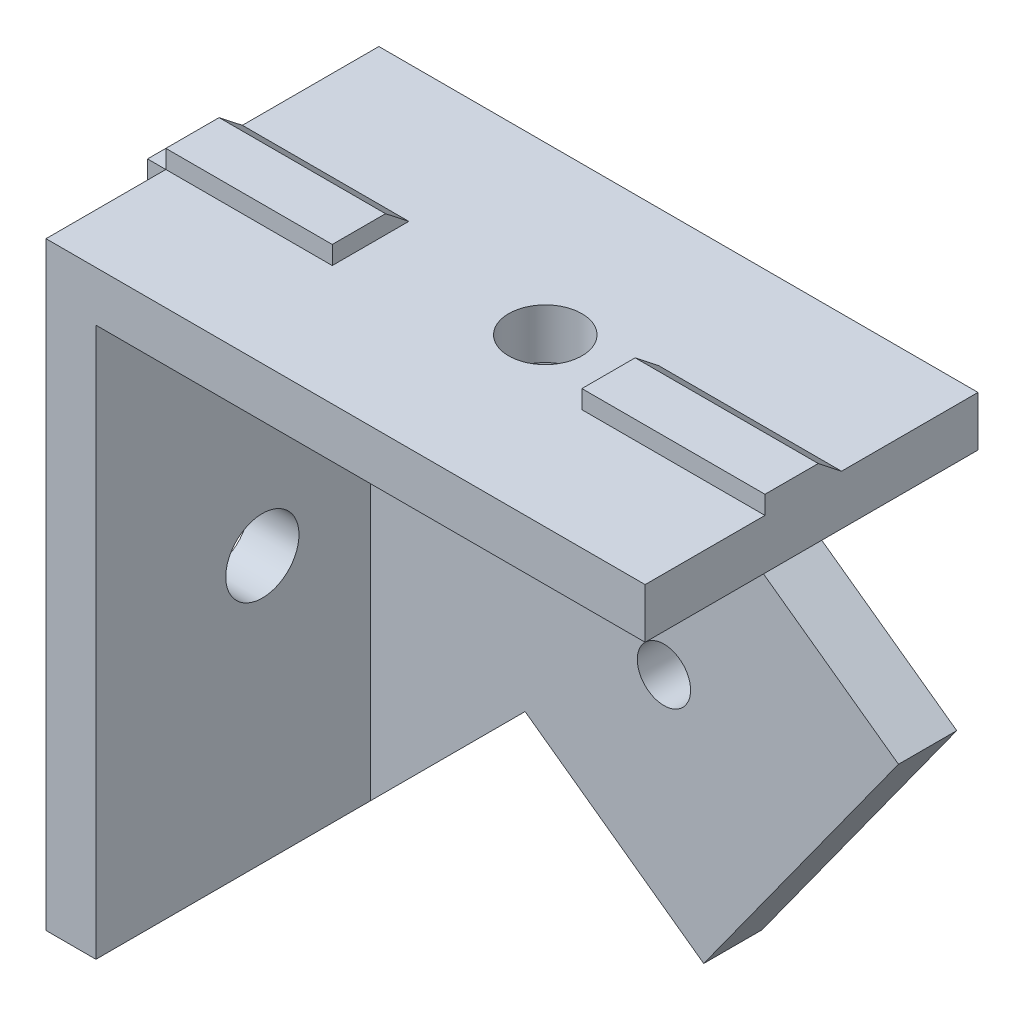
ISO-10303-21;
HEADER;
FILE_DESCRIPTION(('STEP AP214'),'2;1');
FILE_NAME('part.step','',(''),(''),'','','');
FILE_SCHEMA(('AUTOMOTIVE_DESIGN { 1 0 10303 214 1 1 1 1 }'));
ENDSEC;
DATA;
#1=APPLICATION_CONTEXT('core data for automotive mechanical design processes');
#2=APPLICATION_PROTOCOL_DEFINITION('international standard','automotive_design',2000,#1);
#3=PRODUCT_CONTEXT('',#1,'mechanical');
#4=PRODUCT('Part','Part','',(#3));
#5=PRODUCT_RELATED_PRODUCT_CATEGORY('part','',(#4));
#6=PRODUCT_DEFINITION_FORMATION('','',#4);
#7=PRODUCT_DEFINITION_CONTEXT('part definition',#1,'design');
#8=PRODUCT_DEFINITION('design','',#6,#7);
#9=PRODUCT_DEFINITION_SHAPE('','',#8);
#10=(LENGTH_UNIT() NAMED_UNIT(*) SI_UNIT(.MILLI.,.METRE.));
#11=(NAMED_UNIT(*) PLANE_ANGLE_UNIT() SI_UNIT($,.RADIAN.));
#12=(NAMED_UNIT(*) SI_UNIT($,.STERADIAN.) SOLID_ANGLE_UNIT());
#13=UNCERTAINTY_MEASURE_WITH_UNIT(LENGTH_MEASURE(1.E-05),#10,'distance_accuracy_value','');
#14=(GEOMETRIC_REPRESENTATION_CONTEXT(3) GLOBAL_UNCERTAINTY_ASSIGNED_CONTEXT((#13)) GLOBAL_UNIT_ASSIGNED_CONTEXT((#10,
#11,#12)) REPRESENTATION_CONTEXT('',''));
#15=CARTESIAN_POINT('',(0.,0.,0.));
#16=DIRECTION('',(0.,0.,1.));
#17=DIRECTION('',(1.,0.,0.));
#18=AXIS2_PLACEMENT_3D('',#15,#16,#17);
#19=CARTESIAN_POINT('',(36.,-3.,3.5));
#20=DIRECTION('',(-0.707106781186548,0.707106781186548,0.));
#21=DIRECTION('',(-0.707106781186548,-0.707106781186548,0.));
#22=AXIS2_PLACEMENT_3D('',#19,#20,#21);
#23=PLANE('',#22);
#24=DIRECTION('',(0.707106781186547,0.707106781186547,0.));
#25=VECTOR('',#24,1.);
#26=CARTESIAN_POINT('',(36.,-3.,3.5));
#27=LINE('',#26,#25);
#28=CARTESIAN_POINT('',(26.6123822519399,-12.3876177480601,3.5));
#29=VERTEX_POINT('',#28);
#30=CARTESIAN_POINT('',(36.,-3.,3.5));
#31=VERTEX_POINT('',#30);
#32=EDGE_CURVE('E51',#29,#31,#27,.T.);
#33=ORIENTED_EDGE('',*,*,#32,.F.);
#34=DIRECTION('',(0.,0.,1.));
#35=VECTOR('',#34,1.);
#36=CARTESIAN_POINT('',(26.6123822519399,-12.3876177480601,-31.4713419704018));
#37=LINE('',#36,#35);
#38=CARTESIAN_POINT('',(26.6123822519399,-12.3876177480601,0.));
#39=VERTEX_POINT('',#38);
#40=EDGE_CURVE('E220',#39,#29,#37,.T.);
#41=ORIENTED_EDGE('',*,*,#40,.F.);
#42=DIRECTION('',(0.707106781186547,0.707106781186547,0.));
#43=VECTOR('',#42,1.);
#44=CARTESIAN_POINT('',(36.,-3.,0.));
#45=LINE('',#44,#43);
#46=CARTESIAN_POINT('',(36.,-3.,0.));
#47=VERTEX_POINT('',#46);
#48=EDGE_CURVE('E218',#39,#47,#45,.T.);
#49=ORIENTED_EDGE('',*,*,#48,.T.);
#50=DIRECTION('',(0.,0.,-1.));
#51=VECTOR('',#50,1.);
#52=CARTESIAN_POINT('',(36.,-3.,3.5));
#53=LINE('',#52,#51);
#54=EDGE_CURVE('E379',#31,#47,#53,.T.);
#55=ORIENTED_EDGE('',*,*,#54,.F.);
#56=EDGE_LOOP('',(#33,#41,#49,#55));
#57=FACE_BOUND('',#56,.T.);
#58=ADVANCED_FACE('F35',(#57),#23,.F.);
#59=CARTESIAN_POINT('',(-1.1,4.72969343615419,9.6));
#60=DIRECTION('',(-0.786318338822423,0.,-0.617821551931904));
#61=DIRECTION('',(-0.617821551931904,0.,0.786318338822423));
#62=AXIS2_PLACEMENT_3D('',#59,#60,#61);
#63=PLANE('',#62);
#64=DIRECTION('',(-0.617821551931904,0.,0.786318338822423));
#65=VECTOR('',#64,1.);
#66=CARTESIAN_POINT('',(-1.1,-25.,9.6));
#67=LINE('',#66,#65);
#68=CARTESIAN_POINT('',(0.,-25.,8.19999999999999));
#69=VERTEX_POINT('',#68);
#70=CARTESIAN_POINT('',(-1.1,-25.,9.6));
#71=VERTEX_POINT('',#70);
#72=EDGE_CURVE('E262',#69,#71,#67,.T.);
#73=ORIENTED_EDGE('',*,*,#72,.F.);
#74=DIRECTION('',(0.,-1.,0.));
#75=VECTOR('',#74,1.);
#76=CARTESIAN_POINT('',(0.,4.72969343615419,8.2));
#77=LINE('',#76,#75);
#78=CARTESIAN_POINT('',(0.,-36.,8.2));
#79=VERTEX_POINT('',#78);
#80=EDGE_CURVE('E11',#69,#79,#77,.T.);
#81=ORIENTED_EDGE('',*,*,#80,.T.);
#82=DIRECTION('',(0.617821551931904,0.,-0.786318338822423));
#83=VECTOR('',#82,1.);
#84=CARTESIAN_POINT('',(-1.1,-36.,9.6));
#85=LINE('',#84,#83);
#86=CARTESIAN_POINT('',(-1.1,-36.,9.6));
#87=VERTEX_POINT('',#86);
#88=EDGE_CURVE('E264',#87,#79,#85,.T.);
#89=ORIENTED_EDGE('',*,*,#88,.F.);
#90=DIRECTION('',(0.,-1.,0.));
#91=VECTOR('',#90,1.);
#92=CARTESIAN_POINT('',(-1.1,4.72969343615419,9.6));
#93=LINE('',#92,#91);
#94=EDGE_CURVE('E277',#71,#87,#93,.T.);
#95=ORIENTED_EDGE('',*,*,#94,.F.);
#96=EDGE_LOOP('',(#73,#81,#89,#95));
#97=FACE_BOUND('',#96,.T.);
#98=ADVANCED_FACE('F481',(#97),#63,.T.);
#99=CARTESIAN_POINT('',(-1.1,4.72969343615419,12.8));
#100=DIRECTION('',(-1.,0.,0.));
#101=DIRECTION('',(0.,0.,1.));
#102=AXIS2_PLACEMENT_3D('',#99,#100,#101);
#103=PLANE('',#102);
#104=DIRECTION('',(0.,0.,1.));
#105=VECTOR('',#104,1.);
#106=CARTESIAN_POINT('',(-1.1,-25.,-2.50000000007189E-05));
#107=LINE('',#106,#105);
#108=CARTESIAN_POINT('',(-1.1,-25.,12.8));
#109=VERTEX_POINT('',#108);
#110=EDGE_CURVE('E255',#71,#109,#107,.T.);
#111=ORIENTED_EDGE('',*,*,#110,.F.);
#112=ORIENTED_EDGE('',*,*,#94,.T.);
#113=DIRECTION('',(0.,0.,-1.));
#114=VECTOR('',#113,1.);
#115=CARTESIAN_POINT('',(-1.1,-36.,12.8));
#116=LINE('',#115,#114);
#117=CARTESIAN_POINT('',(-1.1,-36.,12.8));
#118=VERTEX_POINT('',#117);
#119=EDGE_CURVE('E269',#118,#87,#116,.T.);
#120=ORIENTED_EDGE('',*,*,#119,.F.);
#121=DIRECTION('',(0.,-1.,0.));
#122=VECTOR('',#121,1.);
#123=CARTESIAN_POINT('',(-1.1,4.72969343615419,12.8));
#124=LINE('',#123,#122);
#125=EDGE_CURVE('E281',#109,#118,#124,.T.);
#126=ORIENTED_EDGE('',*,*,#125,.F.);
#127=EDGE_LOOP('',(#111,#112,#120,#126));
#128=FACE_BOUND('',#127,.T.);
#129=ADVANCED_FACE('F486',(#128),#103,.T.);
#130=CARTESIAN_POINT('',(0.,4.72969343615419,12.8));
#131=DIRECTION('',(0.,0.,1.));
#132=DIRECTION('',(1.,0.,0.));
#133=AXIS2_PLACEMENT_3D('',#130,#131,#132);
#134=PLANE('',#133);
#135=DIRECTION('',(1.,0.,0.));
#136=VECTOR('',#135,1.);
#137=CARTESIAN_POINT('',(0.,-25.,12.8));
#138=LINE('',#137,#136);
#139=CARTESIAN_POINT('',(0.,-25.,12.8));
#140=VERTEX_POINT('',#139);
#141=EDGE_CURVE('E248',#109,#140,#138,.T.);
#142=ORIENTED_EDGE('',*,*,#141,.F.);
#143=ORIENTED_EDGE('',*,*,#125,.T.);
#144=DIRECTION('',(-1.,0.,0.));
#145=VECTOR('',#144,1.);
#146=CARTESIAN_POINT('',(0.,-36.,12.8));
#147=LINE('',#146,#145);
#148=CARTESIAN_POINT('',(0.,-36.,12.8));
#149=VERTEX_POINT('',#148);
#150=EDGE_CURVE('E273',#149,#118,#147,.T.);
#151=ORIENTED_EDGE('',*,*,#150,.F.);
#152=DIRECTION('',(0.,-1.,0.));
#153=VECTOR('',#152,1.);
#154=CARTESIAN_POINT('',(0.,4.72969343615419,12.8));
#155=LINE('',#154,#153);
#156=EDGE_CURVE('E292',#140,#149,#155,.T.);
#157=ORIENTED_EDGE('',*,*,#156,.F.);
#158=EDGE_LOOP('',(#142,#143,#151,#157));
#159=FACE_BOUND('',#158,.T.);
#160=ADVANCED_FACE('F589',(#159),#134,.T.);
#161=CARTESIAN_POINT('',(0.,-36.,3.5));
#162=DIRECTION('',(1.,0.,0.));
#163=DIRECTION('',(0.,0.,-1.));
#164=AXIS2_PLACEMENT_3D('',#161,#162,#163);
#165=PLANE('',#164);
#166=DIRECTION('',(0.,0.,-1.));
#167=VECTOR('',#166,1.);
#168=CARTESIAN_POINT('',(0.,0.,8.2));
#169=LINE('',#168,#167);
#170=CARTESIAN_POINT('',(0.,0.,12.8));
#171=VERTEX_POINT('',#170);
#172=CARTESIAN_POINT('',(0.,0.,8.2));
#173=VERTEX_POINT('',#172);
#174=EDGE_CURVE('E313',#171,#173,#169,.T.);
#175=ORIENTED_EDGE('',*,*,#174,.F.);
#176=DIRECTION('',(0.,-1.,0.));
#177=VECTOR('',#176,1.);
#178=CARTESIAN_POINT('',(0.,0.,12.8));
#179=LINE('',#178,#177);
#180=CARTESIAN_POINT('',(0.,1.1,12.8));
#181=VERTEX_POINT('',#180);
#182=EDGE_CURVE('E337',#181,#171,#179,.T.);
#183=ORIENTED_EDGE('',*,*,#182,.F.);
#184=DIRECTION('',(0.,0.,1.));
#185=VECTOR('',#184,1.);
#186=CARTESIAN_POINT('',(0.,1.1,12.8));
#187=LINE('',#186,#185);
#188=CARTESIAN_POINT('',(0.,1.1,9.6));
#189=VERTEX_POINT('',#188);
#190=EDGE_CURVE('E334',#189,#181,#187,.T.);
#191=ORIENTED_EDGE('',*,*,#190,.F.);
#192=DIRECTION('',(0.,0.617821551931903,0.786318338822423));
#193=VECTOR('',#192,1.);
#194=CARTESIAN_POINT('',(0.,1.1,9.6));
#195=LINE('',#194,#193);
#196=EDGE_CURVE('E338',#173,#189,#195,.T.);
#197=ORIENTED_EDGE('',*,*,#196,.F.);
#198=EDGE_LOOP('',(#175,#183,#191,#197));
#199=FACE_BOUND('',#198,.T.);
#200=ADVANCED_FACE('F478',(#199),#165,.F.);
#201=CARTESIAN_POINT('',(0.,0.,12.8));
#202=DIRECTION('',(0.,0.,1.));
#203=DIRECTION('',(1.,0.,0.));
#204=AXIS2_PLACEMENT_3D('',#201,#202,#203);
#205=PLANE('',#204);
#206=DIRECTION('',(0.,1.,0.));
#207=VECTOR('',#206,1.);
#208=CARTESIAN_POINT('',(25.,1.1,12.8));
#209=LINE('',#208,#207);
#210=CARTESIAN_POINT('',(25.,0.,12.8));
#211=VERTEX_POINT('',#210);
#212=CARTESIAN_POINT('',(25.,1.1,12.8));
#213=VERTEX_POINT('',#212);
#214=EDGE_CURVE('E316',#211,#213,#209,.T.);
#215=ORIENTED_EDGE('',*,*,#214,.F.);
#216=DIRECTION('',(1.,0.,0.));
#217=VECTOR('',#216,1.);
#218=CARTESIAN_POINT('',(0.,0.,12.8));
#219=LINE('',#218,#217);
#220=CARTESIAN_POINT('',(36.,0.,12.8));
#221=VERTEX_POINT('',#220);
#222=EDGE_CURVE('E353',#211,#221,#219,.T.);
#223=ORIENTED_EDGE('',*,*,#222,.T.);
#224=DIRECTION('',(0.,-1.,0.));
#225=VECTOR('',#224,1.);
#226=CARTESIAN_POINT('',(36.,0.,12.8));
#227=LINE('',#226,#225);
#228=CARTESIAN_POINT('',(36.,1.1,12.8));
#229=VERTEX_POINT('',#228);
#230=EDGE_CURVE('E342',#229,#221,#227,.T.);
#231=ORIENTED_EDGE('',*,*,#230,.F.);
#232=DIRECTION('',(1.,0.,0.));
#233=VECTOR('',#232,1.);
#234=CARTESIAN_POINT('',(0.,1.1,12.8));
#235=LINE('',#234,#233);
#236=EDGE_CURVE('E872',#213,#229,#235,.T.);
#237=ORIENTED_EDGE('',*,*,#236,.F.);
#238=EDGE_LOOP('',(#215,#223,#231,#237));
#239=FACE_BOUND('',#238,.T.);
#240=ADVANCED_FACE('F596',(#239),#205,.T.);
#241=CARTESIAN_POINT('',(0.,1.1,12.8));
#242=DIRECTION('',(0.,1.,0.));
#243=DIRECTION('',(0.,0.,1.));
#244=AXIS2_PLACEMENT_3D('',#241,#242,#243);
#245=PLANE('',#244);
#246=DIRECTION('',(0.,0.,1.));
#247=VECTOR('',#246,1.);
#248=CARTESIAN_POINT('',(25.,1.1,-2.50000000007189E-05));
#249=LINE('',#248,#247);
#250=CARTESIAN_POINT('',(25.,1.1,9.6));
#251=VERTEX_POINT('',#250);
#252=EDGE_CURVE('E324',#251,#213,#249,.T.);
#253=ORIENTED_EDGE('',*,*,#252,.T.);
#254=ORIENTED_EDGE('',*,*,#236,.T.);
#255=DIRECTION('',(0.,0.,1.));
#256=VECTOR('',#255,1.);
#257=CARTESIAN_POINT('',(36.,1.1,12.8));
#258=LINE('',#257,#256);
#259=CARTESIAN_POINT('',(36.,1.1,9.6));
#260=VERTEX_POINT('',#259);
#261=EDGE_CURVE('E339',#260,#229,#258,.T.);
#262=ORIENTED_EDGE('',*,*,#261,.F.);
#263=DIRECTION('',(1.,0.,0.));
#264=VECTOR('',#263,1.);
#265=CARTESIAN_POINT('',(0.,1.1,9.6));
#266=LINE('',#265,#264);
#267=EDGE_CURVE('E399',#251,#260,#266,.T.);
#268=ORIENTED_EDGE('',*,*,#267,.F.);
#269=EDGE_LOOP('',(#253,#254,#262,#268));
#270=FACE_BOUND('',#269,.T.);
#271=ADVANCED_FACE('F735',(#270),#245,.T.);
#272=CARTESIAN_POINT('',(0.,1.1,9.6));
#273=DIRECTION('',(0.,0.786318338822423,-0.617821551931903));
#274=DIRECTION('',(0.,0.617821551931904,0.786318338822423));
#275=AXIS2_PLACEMENT_3D('',#272,#273,#274);
#276=PLANE('',#275);
#277=DIRECTION('',(0.,-0.617821551931904,-0.786318338822423));
#278=VECTOR('',#277,1.);
#279=CARTESIAN_POINT('',(25.,1.1,9.6));
#280=LINE('',#279,#278);
#281=CARTESIAN_POINT('',(25.,0.,8.2));
#282=VERTEX_POINT('',#281);
#283=EDGE_CURVE('E44',#251,#282,#280,.T.);
#284=ORIENTED_EDGE('',*,*,#283,.F.);
#285=ORIENTED_EDGE('',*,*,#267,.T.);
#286=DIRECTION('',(0.,0.617821551931903,0.786318338822423));
#287=VECTOR('',#286,1.);
#288=CARTESIAN_POINT('',(36.,1.1,9.6));
#289=LINE('',#288,#287);
#290=CARTESIAN_POINT('',(36.,0.,8.2));
#291=VERTEX_POINT('',#290);
#292=EDGE_CURVE('E327',#291,#260,#289,.T.);
#293=ORIENTED_EDGE('',*,*,#292,.F.);
#294=DIRECTION('',(1.,0.,0.));
#295=VECTOR('',#294,1.);
#296=CARTESIAN_POINT('',(0.,0.,8.2));
#297=LINE('',#296,#295);
#298=EDGE_CURVE('E378',#282,#291,#297,.T.);
#299=ORIENTED_EDGE('',*,*,#298,.F.);
#300=EDGE_LOOP('',(#284,#285,#293,#299));
#301=FACE_BOUND('',#300,.T.);
#302=ADVANCED_FACE('F425',(#301),#276,.T.);
#303=CARTESIAN_POINT('',(0.,0.,3.5));
#304=DIRECTION('',(0.,0.,-1.));
#305=DIRECTION('',(-1.,0.,0.));
#306=AXIS2_PLACEMENT_3D('',#303,#304,#305);
#307=PLANE('',#306);
#308=CARTESIAN_POINT('',(20.62970811701,-20.62970811701,3.5));
#309=DIRECTION('',(0.,0.,1.));
#310=DIRECTION('',(1.,0.,0.));
#311=AXIS2_PLACEMENT_3D('',#308,#309,#310);
#312=CIRCLE('',#311,1.6);
#313=CARTESIAN_POINT('',(22.22970811701,-20.62970811701,3.5));
#314=VERTEX_POINT('',#313);
#315=EDGE_CURVE('E457',#314,#314,#312,.T.);
#316=ORIENTED_EDGE('',*,*,#315,.F.);
#317=EDGE_LOOP('',(#316));
#318=FACE_BOUND('',#317,.T.);
#319=DIRECTION('',(1.,0.,0.));
#320=VECTOR('',#319,1.);
#321=CARTESIAN_POINT('',(36.,-3.,3.5));
#322=LINE('',#321,#320);
#323=CARTESIAN_POINT('',(3.,-3.,3.5));
#324=VERTEX_POINT('',#323);
#325=EDGE_CURVE('E563',#324,#31,#322,.T.);
#326=ORIENTED_EDGE('',*,*,#325,.F.);
#327=DIRECTION('',(0.,1.,0.));
#328=VECTOR('',#327,1.);
#329=CARTESIAN_POINT('',(3.,-3.,3.5));
#330=LINE('',#329,#328);
#331=CARTESIAN_POINT('',(3.,-36.,3.5));
#332=VERTEX_POINT('',#331);
#333=EDGE_CURVE('E556',#332,#324,#330,.T.);
#334=ORIENTED_EDGE('',*,*,#333,.F.);
#335=CARTESIAN_POINT('',(12.2863928787447,-26.7136071212553,3.5));
#336=VERTEX_POINT('',#335);
#337=EDGE_CURVE('E442',#332,#336,#27,.T.);
#338=ORIENTED_EDGE('',*,*,#337,.T.);
#339=DIRECTION('',(0.810953417130081,-0.585110720500867,0.));
#340=VECTOR('',#339,1.);
#341=CARTESIAN_POINT('',(23.0197020132234,-34.4577932956704,3.5));
#342=LINE('',#341,#340);
#343=CARTESIAN_POINT('',(23.0197020132234,-34.4577932956704,3.5));
#344=VERTEX_POINT('',#343);
#345=EDGE_CURVE('E239',#336,#344,#342,.T.);
#346=ORIENTED_EDGE('',*,*,#345,.T.);
#347=DIRECTION('',(0.585110720500867,0.810953417130081,0.));
#348=VECTOR('',#347,1.);
#349=CARTESIAN_POINT('',(34.7219164232408,-18.2387249530687,3.5));
#350=LINE('',#349,#348);
#351=CARTESIAN_POINT('',(34.7219164232408,-18.2387249530687,3.5));
#352=VERTEX_POINT('',#351);
#353=EDGE_CURVE('E235',#344,#352,#350,.T.);
#354=ORIENTED_EDGE('',*,*,#353,.T.);
#355=DIRECTION('',(-0.810953417130081,0.585110720500868,0.));
#356=VECTOR('',#355,1.);
#357=CARTESIAN_POINT('',(26.6123822519399,-12.3876177480601,3.5));
#358=LINE('',#357,#356);
#359=EDGE_CURVE('E226',#352,#29,#358,.T.);
#360=ORIENTED_EDGE('',*,*,#359,.T.);
#361=ORIENTED_EDGE('',*,*,#32,.T.);
#362=EDGE_LOOP('',(#326,#334,#338,#346,#354,#360,#361));
#363=FACE_BOUND('',#362,.T.);
#364=ADVANCED_FACE('F453',(#318,#363),#307,.F.);
#365=CARTESIAN_POINT('',(3.,-36.,3.5));
#366=DIRECTION('',(0.,1.,0.));
#367=DIRECTION('',(0.,0.,1.));
#368=AXIS2_PLACEMENT_3D('',#365,#366,#367);
#369=PLANE('',#368);
#370=DIRECTION('',(1.,0.,0.));
#371=VECTOR('',#370,1.);
#372=CARTESIAN_POINT('',(3.,-36.,0.));
#373=LINE('',#372,#371);
#374=CARTESIAN_POINT('',(0.,-36.,0.));
#375=VERTEX_POINT('',#374);
#376=CARTESIAN_POINT('',(3.,-36.,0.));
#377=VERTEX_POINT('',#376);
#378=EDGE_CURVE('E441',#375,#377,#373,.T.);
#379=ORIENTED_EDGE('',*,*,#378,.T.);
#380=DIRECTION('',(0.,0.,-1.));
#381=VECTOR('',#380,1.);
#382=CARTESIAN_POINT('',(3.,-36.,3.5));
#383=LINE('',#382,#381);
#384=EDGE_CURVE('E376',#332,#377,#383,.T.);
#385=ORIENTED_EDGE('',*,*,#384,.F.);
#386=DIRECTION('',(0.,0.,-1.));
#387=VECTOR('',#386,1.);
#388=CARTESIAN_POINT('',(3.,-36.,20.));
#389=LINE('',#388,#387);
#390=CARTESIAN_POINT('',(3.,-36.,20.));
#391=VERTEX_POINT('',#390);
#392=EDGE_CURVE('E447',#391,#332,#389,.T.);
#393=ORIENTED_EDGE('',*,*,#392,.F.);
#394=DIRECTION('',(1.,0.,0.));
#395=VECTOR('',#394,1.);
#396=CARTESIAN_POINT('',(3.,-36.,20.));
#397=LINE('',#396,#395);
#398=CARTESIAN_POINT('',(0.,-36.,20.));
#399=VERTEX_POINT('',#398);
#400=EDGE_CURVE('E559',#399,#391,#397,.T.);
#401=ORIENTED_EDGE('',*,*,#400,.F.);
#402=DIRECTION('',(0.,0.,-1.));
#403=VECTOR('',#402,1.);
#404=CARTESIAN_POINT('',(0.,-36.,3.5));
#405=LINE('',#404,#403);
#406=EDGE_CURVE('E356',#399,#149,#405,.T.);
#407=ORIENTED_EDGE('',*,*,#406,.T.);
#408=ORIENTED_EDGE('',*,*,#150,.T.);
#409=ORIENTED_EDGE('',*,*,#119,.T.);
#410=ORIENTED_EDGE('',*,*,#88,.T.);
#411=EDGE_CURVE('E306',#79,#375,#405,.T.);
#412=ORIENTED_EDGE('',*,*,#411,.T.);
#413=EDGE_LOOP('',(#379,#385,#393,#401,#407,#408,#409,#410,#412));
#414=FACE_BOUND('',#413,.T.);
#415=ADVANCED_FACE('F37',(#414),#369,.F.);
#416=CARTESIAN_POINT('',(12.2863928787447,-26.7136071212553,0.));
#417=VERTEX_POINT('',#416);
#418=EDGE_CURVE('E450',#377,#417,#45,.T.);
#419=ORIENTED_EDGE('',*,*,#418,.T.);
#420=DIRECTION('',(0.,0.,1.));
#421=VECTOR('',#420,1.);
#422=CARTESIAN_POINT('',(12.2863928787447,-26.7136071212553,-31.4713419704018));
#423=LINE('',#422,#421);
#424=EDGE_CURVE('E59',#417,#336,#423,.T.);
#425=ORIENTED_EDGE('',*,*,#424,.T.);
#426=ORIENTED_EDGE('',*,*,#337,.F.);
#427=ORIENTED_EDGE('',*,*,#384,.T.);
#428=EDGE_LOOP('',(#419,#425,#426,#427));
#429=FACE_BOUND('',#428,.T.);
#430=ADVANCED_FACE('F482',(#429),#23,.F.);
#431=CARTESIAN_POINT('',(36.,0.,3.5));
#432=DIRECTION('',(-1.,0.,0.));
#433=DIRECTION('',(0.,0.,1.));
#434=AXIS2_PLACEMENT_3D('',#431,#432,#433);
#435=PLANE('',#434);
#436=DIRECTION('',(0.,1.,0.));
#437=VECTOR('',#436,1.);
#438=CARTESIAN_POINT('',(36.,0.,0.));
#439=LINE('',#438,#437);
#440=CARTESIAN_POINT('',(36.,0.,0.));
#441=VERTEX_POINT('',#440);
#442=EDGE_CURVE('E429',#47,#441,#439,.T.);
#443=ORIENTED_EDGE('',*,*,#442,.T.);
#444=DIRECTION('',(0.,0.,-1.));
#445=VECTOR('',#444,1.);
#446=CARTESIAN_POINT('',(36.,0.,3.5));
#447=LINE('',#446,#445);
#448=EDGE_CURVE('E375',#291,#441,#447,.T.);
#449=ORIENTED_EDGE('',*,*,#448,.F.);
#450=ORIENTED_EDGE('',*,*,#292,.T.);
#451=ORIENTED_EDGE('',*,*,#261,.T.);
#452=ORIENTED_EDGE('',*,*,#230,.T.);
#453=CARTESIAN_POINT('',(36.,0.,20.));
#454=VERTEX_POINT('',#453);
#455=EDGE_CURVE('E381',#454,#221,#447,.T.);
#456=ORIENTED_EDGE('',*,*,#455,.F.);
#457=DIRECTION('',(0.,1.,0.));
#458=VECTOR('',#457,1.);
#459=CARTESIAN_POINT('',(36.,0.,20.));
#460=LINE('',#459,#458);
#461=CARTESIAN_POINT('',(36.,-3.,20.));
#462=VERTEX_POINT('',#461);
#463=EDGE_CURVE('E567',#462,#454,#460,.T.);
#464=ORIENTED_EDGE('',*,*,#463,.F.);
#465=DIRECTION('',(0.,0.,-1.));
#466=VECTOR('',#465,1.);
#467=CARTESIAN_POINT('',(36.,-3.,20.));
#468=LINE('',#467,#466);
#469=EDGE_CURVE('E575',#462,#31,#468,.T.);
#470=ORIENTED_EDGE('',*,*,#469,.T.);
#471=ORIENTED_EDGE('',*,*,#54,.T.);
#472=EDGE_LOOP('',(#443,#449,#450,#451,#452,#456,#464,#470,#471));
#473=FACE_BOUND('',#472,.T.);
#474=ADVANCED_FACE('F428',(#473),#435,.F.);
#475=CARTESIAN_POINT('',(0.,0.,3.5));
#476=DIRECTION('',(0.,-1.,0.));
#477=DIRECTION('',(0.,0.,-1.));
#478=AXIS2_PLACEMENT_3D('',#475,#476,#477);
#479=PLANE('',#478);
#480=CARTESIAN_POINT('',(10.,0.,8.2));
#481=VERTEX_POINT('',#480);
#482=EDGE_CURVE('E395',#173,#481,#297,.T.);
#483=ORIENTED_EDGE('',*,*,#482,.T.);
#484=DIRECTION('',(0.,0.,1.));
#485=VECTOR('',#484,1.);
#486=CARTESIAN_POINT('',(10.,0.,-2.50000000007189E-05));
#487=LINE('',#486,#485);
#488=CARTESIAN_POINT('',(10.,0.,12.8));
#489=VERTEX_POINT('',#488);
#490=EDGE_CURVE('E328',#481,#489,#487,.T.);
#491=ORIENTED_EDGE('',*,*,#490,.T.);
#492=EDGE_CURVE('E349',#171,#489,#219,.T.);
#493=ORIENTED_EDGE('',*,*,#492,.F.);
#494=DIRECTION('',(0.,0.,-1.));
#495=VECTOR('',#494,1.);
#496=CARTESIAN_POINT('',(0.,0.,3.5));
#497=LINE('',#496,#495);
#498=CARTESIAN_POINT('',(0.,0.,20.));
#499=VERTEX_POINT('',#498);
#500=EDGE_CURVE('E372',#499,#171,#497,.T.);
#501=ORIENTED_EDGE('',*,*,#500,.F.);
#502=DIRECTION('',(-1.,0.,0.));
#503=VECTOR('',#502,1.);
#504=CARTESIAN_POINT('',(0.,0.,20.));
#505=LINE('',#504,#503);
#506=EDGE_CURVE('E570',#454,#499,#505,.T.);
#507=ORIENTED_EDGE('',*,*,#506,.F.);
#508=ORIENTED_EDGE('',*,*,#455,.T.);
#509=ORIENTED_EDGE('',*,*,#222,.F.);
#510=DIRECTION('',(0.,0.,1.));
#511=VECTOR('',#510,1.);
#512=CARTESIAN_POINT('',(25.,0.,-2.50000000007189E-05));
#513=LINE('',#512,#511);
#514=EDGE_CURVE('E325',#282,#211,#513,.T.);
#515=ORIENTED_EDGE('',*,*,#514,.F.);
#516=ORIENTED_EDGE('',*,*,#298,.T.);
#517=ORIENTED_EDGE('',*,*,#448,.T.);
#518=DIRECTION('',(-1.,0.,0.));
#519=VECTOR('',#518,1.);
#520=CARTESIAN_POINT('',(0.,0.,0.));
#521=LINE('',#520,#519);
#522=CARTESIAN_POINT('',(0.,0.,0.));
#523=VERTEX_POINT('',#522);
#524=EDGE_CURVE('E432',#441,#523,#521,.T.);
#525=ORIENTED_EDGE('',*,*,#524,.T.);
#526=EDGE_CURVE('E357',#173,#523,#497,.T.);
#527=ORIENTED_EDGE('',*,*,#526,.F.);
#528=EDGE_LOOP('',(#483,#491,#493,#501,#507,#508,#509,#515,#516,#517,#525,#527));
#529=FACE_BOUND('',#528,.T.);
#530=CARTESIAN_POINT('',(20.,0.,10.));
#531=DIRECTION('',(0.,-1.,0.));
#532=DIRECTION('',(0.,0.,-1.));
#533=AXIS2_PLACEMENT_3D('',#530,#531,#532);
#534=CIRCLE('',#533,2.2);
#535=CARTESIAN_POINT('',(20.,0.,7.8));
#536=VERTEX_POINT('',#535);
#537=EDGE_CURVE('E553',#536,#536,#534,.T.);
#538=ORIENTED_EDGE('',*,*,#537,.T.);
#539=EDGE_LOOP('',(#538));
#540=FACE_BOUND('',#539,.T.);
#541=ADVANCED_FACE('F422',(#529,#540),#479,.F.);
#542=CARTESIAN_POINT('',(0.,-20.,10.));
#543=DIRECTION('',(1.,0.,0.));
#544=DIRECTION('',(0.,0.,-1.));
#545=AXIS2_PLACEMENT_3D('',#542,#543,#544);
#546=CIRCLE('',#545,2.2);
#547=CARTESIAN_POINT('',(0.,-20.,7.8));
#548=VERTEX_POINT('',#547);
#549=EDGE_CURVE('E403',#548,#548,#546,.T.);
#550=ORIENTED_EDGE('',*,*,#549,.T.);
#551=EDGE_LOOP('',(#550));
#552=FACE_BOUND('',#551,.T.);
#553=ORIENTED_EDGE('',*,*,#500,.T.);
#554=CARTESIAN_POINT('',(0.,-10.,12.8));
#555=VERTEX_POINT('',#554);
#556=EDGE_CURVE('E288',#171,#555,#155,.T.);
#557=ORIENTED_EDGE('',*,*,#556,.T.);
#558=DIRECTION('',(0.,0.,1.));
#559=VECTOR('',#558,1.);
#560=CARTESIAN_POINT('',(0.,-10.,-2.50000000007189E-05));
#561=LINE('',#560,#559);
#562=CARTESIAN_POINT('',(0.,-10.,8.2));
#563=VERTEX_POINT('',#562);
#564=EDGE_CURVE('E251',#563,#555,#561,.T.);
#565=ORIENTED_EDGE('',*,*,#564,.F.);
#566=EDGE_CURVE('E272',#173,#563,#77,.T.);
#567=ORIENTED_EDGE('',*,*,#566,.F.);
#568=ORIENTED_EDGE('',*,*,#526,.T.);
#569=DIRECTION('',(0.,-1.,0.));
#570=VECTOR('',#569,1.);
#571=CARTESIAN_POINT('',(0.,-36.,0.));
#572=LINE('',#571,#570);
#573=EDGE_CURVE('E361',#523,#375,#572,.T.);
#574=ORIENTED_EDGE('',*,*,#573,.T.);
#575=ORIENTED_EDGE('',*,*,#411,.F.);
#576=ORIENTED_EDGE('',*,*,#80,.F.);
#577=DIRECTION('',(0.,0.,1.));
#578=VECTOR('',#577,1.);
#579=CARTESIAN_POINT('',(0.,-25.,-2.50000000007189E-05));
#580=LINE('',#579,#578);
#581=EDGE_CURVE('E252',#69,#140,#580,.T.);
#582=ORIENTED_EDGE('',*,*,#581,.T.);
#583=ORIENTED_EDGE('',*,*,#156,.T.);
#584=ORIENTED_EDGE('',*,*,#406,.F.);
#585=DIRECTION('',(0.,-1.,0.));
#586=VECTOR('',#585,1.);
#587=CARTESIAN_POINT('',(0.,-36.,20.));
#588=LINE('',#587,#586);
#589=EDGE_CURVE('E572',#499,#399,#588,.T.);
#590=ORIENTED_EDGE('',*,*,#589,.F.);
#591=EDGE_LOOP('',(#553,#557,#565,#567,#568,#574,#575,#576,#582,#583,#584,#590));
#592=FACE_BOUND('',#591,.T.);
#593=ADVANCED_FACE('F436',(#552,#592),#165,.F.);
#594=CARTESIAN_POINT('',(0.,0.,0.));
#595=DIRECTION('',(0.,0.,-1.));
#596=DIRECTION('',(-1.,0.,0.));
#597=AXIS2_PLACEMENT_3D('',#594,#595,#596);
#598=PLANE('',#597);
#599=CARTESIAN_POINT('',(20.62970811701,-20.62970811701,0.));
#600=DIRECTION('',(0.,0.,-1.));
#601=DIRECTION('',(-1.,0.,0.));
#602=AXIS2_PLACEMENT_3D('',#599,#600,#601);
#603=CIRCLE('',#602,1.6);
#604=CARTESIAN_POINT('',(19.02970811701,-20.62970811701,0.));
#605=VERTEX_POINT('',#604);
#606=EDGE_CURVE('E39',#605,#605,#603,.T.);
#607=ORIENTED_EDGE('',*,*,#606,.F.);
#608=EDGE_LOOP('',(#607));
#609=FACE_BOUND('',#608,.T.);
#610=ORIENTED_EDGE('',*,*,#378,.F.);
#611=ORIENTED_EDGE('',*,*,#573,.F.);
#612=ORIENTED_EDGE('',*,*,#524,.F.);
#613=ORIENTED_EDGE('',*,*,#442,.F.);
#614=ORIENTED_EDGE('',*,*,#48,.F.);
#615=DIRECTION('',(-0.810953417130081,0.585110720500868,0.));
#616=VECTOR('',#615,1.);
#617=CARTESIAN_POINT('',(26.6123822519399,-12.3876177480601,0.));
#618=LINE('',#617,#616);
#619=CARTESIAN_POINT('',(34.7219164232408,-18.2387249530687,0.));
#620=VERTEX_POINT('',#619);
#621=EDGE_CURVE('E209',#620,#39,#618,.T.);
#622=ORIENTED_EDGE('',*,*,#621,.F.);
#623=DIRECTION('',(0.585110720500868,0.810953417130082,0.));
#624=VECTOR('',#623,1.);
#625=CARTESIAN_POINT('',(34.7219164232408,-18.2387249530687,0.));
#626=LINE('',#625,#624);
#627=CARTESIAN_POINT('',(23.0197020132234,-34.4577932956704,0.));
#628=VERTEX_POINT('',#627);
#629=EDGE_CURVE('E215',#628,#620,#626,.T.);
#630=ORIENTED_EDGE('',*,*,#629,.F.);
#631=DIRECTION('',(0.810953417130082,-0.585110720500868,0.));
#632=VECTOR('',#631,1.);
#633=CARTESIAN_POINT('',(23.0197020132234,-34.4577932956704,0.));
#634=LINE('',#633,#632);
#635=EDGE_CURVE('E241',#417,#628,#634,.T.);
#636=ORIENTED_EDGE('',*,*,#635,.F.);
#637=ORIENTED_EDGE('',*,*,#418,.F.);
#638=EDGE_LOOP('',(#610,#611,#612,#613,#614,#622,#630,#636,#637));
#639=FACE_BOUND('',#638,.T.);
#640=ADVANCED_FACE('F212',(#609,#639),#598,.T.);
#641=CARTESIAN_POINT('',(3.,-3.,20.));
#642=DIRECTION('',(-1.,0.,0.));
#643=DIRECTION('',(0.,0.,1.));
#644=AXIS2_PLACEMENT_3D('',#641,#642,#643);
#645=PLANE('',#644);
#646=CARTESIAN_POINT('',(3.,-20.,10.));
#647=DIRECTION('',(1.,0.,0.));
#648=DIRECTION('',(0.,0.,-1.));
#649=AXIS2_PLACEMENT_3D('',#646,#647,#648);
#650=CIRCLE('',#649,2.2);
#651=CARTESIAN_POINT('',(3.,-20.,7.8));
#652=VERTEX_POINT('',#651);
#653=EDGE_CURVE('E546',#652,#652,#650,.T.);
#654=ORIENTED_EDGE('',*,*,#653,.F.);
#655=EDGE_LOOP('',(#654));
#656=FACE_BOUND('',#655,.T.);
#657=ORIENTED_EDGE('',*,*,#333,.T.);
#658=DIRECTION('',(0.,0.,-1.));
#659=VECTOR('',#658,1.);
#660=CARTESIAN_POINT('',(3.,-3.,20.));
#661=LINE('',#660,#659);
#662=CARTESIAN_POINT('',(3.,-3.,20.));
#663=VERTEX_POINT('',#662);
#664=EDGE_CURVE('E579',#663,#324,#661,.T.);
#665=ORIENTED_EDGE('',*,*,#664,.F.);
#666=DIRECTION('',(0.,1.,0.));
#667=VECTOR('',#666,1.);
#668=CARTESIAN_POINT('',(3.,-3.,20.));
#669=LINE('',#668,#667);
#670=EDGE_CURVE('E562',#391,#663,#669,.T.);
#671=ORIENTED_EDGE('',*,*,#670,.F.);
#672=ORIENTED_EDGE('',*,*,#392,.T.);
#673=EDGE_LOOP('',(#657,#665,#671,#672));
#674=FACE_BOUND('',#673,.T.);
#675=ADVANCED_FACE('F467',(#656,#674),#645,.F.);
#676=CARTESIAN_POINT('',(36.,-3.,20.));
#677=DIRECTION('',(0.,1.,0.));
#678=DIRECTION('',(0.,0.,1.));
#679=AXIS2_PLACEMENT_3D('',#676,#677,#678);
#680=PLANE('',#679);
#681=CARTESIAN_POINT('',(20.,-3.,10.));
#682=DIRECTION('',(0.,-1.,0.));
#683=DIRECTION('',(0.,0.,-1.));
#684=AXIS2_PLACEMENT_3D('',#681,#682,#683);
#685=CIRCLE('',#684,2.2);
#686=CARTESIAN_POINT('',(20.,-3.,7.8));
#687=VERTEX_POINT('',#686);
#688=EDGE_CURVE('E551',#687,#687,#685,.T.);
#689=ORIENTED_EDGE('',*,*,#688,.F.);
#690=EDGE_LOOP('',(#689));
#691=FACE_BOUND('',#690,.T.);
#692=ORIENTED_EDGE('',*,*,#325,.T.);
#693=ORIENTED_EDGE('',*,*,#469,.F.);
#694=DIRECTION('',(1.,0.,0.));
#695=VECTOR('',#694,1.);
#696=CARTESIAN_POINT('',(36.,-3.,20.));
#697=LINE('',#696,#695);
#698=EDGE_CURVE('E565',#663,#462,#697,.T.);
#699=ORIENTED_EDGE('',*,*,#698,.F.);
#700=ORIENTED_EDGE('',*,*,#664,.T.);
#701=EDGE_LOOP('',(#692,#693,#699,#700));
#702=FACE_BOUND('',#701,.T.);
#703=ADVANCED_FACE('F473',(#691,#702),#680,.F.);
#704=CARTESIAN_POINT('',(0.,0.,20.));
#705=DIRECTION('',(0.,0.,-1.));
#706=DIRECTION('',(-1.,0.,0.));
#707=AXIS2_PLACEMENT_3D('',#704,#705,#706);
#708=PLANE('',#707);
#709=ORIENTED_EDGE('',*,*,#400,.T.);
#710=ORIENTED_EDGE('',*,*,#670,.T.);
#711=ORIENTED_EDGE('',*,*,#698,.T.);
#712=ORIENTED_EDGE('',*,*,#463,.T.);
#713=ORIENTED_EDGE('',*,*,#506,.T.);
#714=ORIENTED_EDGE('',*,*,#589,.T.);
#715=EDGE_LOOP('',(#709,#710,#711,#712,#713,#714));
#716=FACE_BOUND('',#715,.T.);
#717=ADVANCED_FACE('F587',(#716),#708,.F.);
#718=CARTESIAN_POINT('',(20.,0.,10.));
#719=DIRECTION('',(0.,-1.,0.));
#720=DIRECTION('',(0.,0.,-1.));
#721=AXIS2_PLACEMENT_3D('',#718,#719,#720);
#722=CYLINDRICAL_SURFACE('',#721,2.2);
#723=ORIENTED_EDGE('',*,*,#537,.F.);
#724=EDGE_LOOP('',(#723));
#725=FACE_BOUND('',#724,.T.);
#726=ORIENTED_EDGE('',*,*,#688,.T.);
#727=EDGE_LOOP('',(#726));
#728=FACE_BOUND('',#727,.T.);
#729=ADVANCED_FACE('F690',(#725,#728),#722,.F.);
#730=CARTESIAN_POINT('',(0.,-20.,10.));
#731=DIRECTION('',(1.,0.,0.));
#732=DIRECTION('',(0.,0.,-1.));
#733=AXIS2_PLACEMENT_3D('',#730,#731,#732);
#734=CYLINDRICAL_SURFACE('',#733,2.2);
#735=ORIENTED_EDGE('',*,*,#549,.F.);
#736=EDGE_LOOP('',(#735));
#737=FACE_BOUND('',#736,.T.);
#738=ORIENTED_EDGE('',*,*,#653,.T.);
#739=EDGE_LOOP('',(#738));
#740=FACE_BOUND('',#739,.T.);
#741=ADVANCED_FACE('F685',(#737,#740),#734,.F.);
#742=DIRECTION('',(0.,-1.,0.));
#743=VECTOR('',#742,1.);
#744=CARTESIAN_POINT('',(10.,1.1,12.8));
#745=LINE('',#744,#743);
#746=CARTESIAN_POINT('',(10.,1.1,12.8));
#747=VERTEX_POINT('',#746);
#748=EDGE_CURVE('E321',#747,#489,#745,.T.);
#749=ORIENTED_EDGE('',*,*,#748,.F.);
#750=EDGE_CURVE('E345',#181,#747,#235,.T.);
#751=ORIENTED_EDGE('',*,*,#750,.F.);
#752=ORIENTED_EDGE('',*,*,#182,.T.);
#753=ORIENTED_EDGE('',*,*,#492,.T.);
#754=EDGE_LOOP('',(#749,#751,#752,#753));
#755=FACE_BOUND('',#754,.T.);
#756=ADVANCED_FACE('F543',(#755),#205,.T.);
#757=DIRECTION('',(0.,0.,1.));
#758=VECTOR('',#757,1.);
#759=CARTESIAN_POINT('',(10.,1.1,-2.50000000007189E-05));
#760=LINE('',#759,#758);
#761=CARTESIAN_POINT('',(10.,1.1,9.6));
#762=VERTEX_POINT('',#761);
#763=EDGE_CURVE('E330',#762,#747,#760,.T.);
#764=ORIENTED_EDGE('',*,*,#763,.F.);
#765=EDGE_CURVE('E402',#189,#762,#266,.T.);
#766=ORIENTED_EDGE('',*,*,#765,.F.);
#767=ORIENTED_EDGE('',*,*,#190,.T.);
#768=ORIENTED_EDGE('',*,*,#750,.T.);
#769=EDGE_LOOP('',(#764,#766,#767,#768));
#770=FACE_BOUND('',#769,.T.);
#771=ADVANCED_FACE('F729',(#770),#245,.T.);
#772=DIRECTION('',(0.,0.617821551931904,0.786318338822423));
#773=VECTOR('',#772,1.);
#774=CARTESIAN_POINT('',(10.,1.1,9.6));
#775=LINE('',#774,#773);
#776=EDGE_CURVE('E408',#481,#762,#775,.T.);
#777=ORIENTED_EDGE('',*,*,#776,.F.);
#778=ORIENTED_EDGE('',*,*,#482,.F.);
#779=ORIENTED_EDGE('',*,*,#196,.T.);
#780=ORIENTED_EDGE('',*,*,#765,.T.);
#781=EDGE_LOOP('',(#777,#778,#779,#780));
#782=FACE_BOUND('',#781,.T.);
#783=ADVANCED_FACE('F657',(#782),#276,.T.);
#784=CARTESIAN_POINT('',(25.,1.1,-2.50000000007189E-05));
#785=DIRECTION('',(1.,0.,0.));
#786=DIRECTION('',(0.,0.,-1.));
#787=AXIS2_PLACEMENT_3D('',#784,#785,#786);
#788=PLANE('',#787);
#789=ORIENTED_EDGE('',*,*,#283,.T.);
#790=ORIENTED_EDGE('',*,*,#514,.T.);
#791=ORIENTED_EDGE('',*,*,#214,.T.);
#792=ORIENTED_EDGE('',*,*,#252,.F.);
#793=EDGE_LOOP('',(#789,#790,#791,#792));
#794=FACE_BOUND('',#793,.T.);
#795=ADVANCED_FACE('F417',(#794),#788,.F.);
#796=CARTESIAN_POINT('',(10.,1.1,-2.50000000007189E-05));
#797=DIRECTION('',(-1.,0.,0.));
#798=DIRECTION('',(0.,0.,1.));
#799=AXIS2_PLACEMENT_3D('',#796,#797,#798);
#800=PLANE('',#799);
#801=ORIENTED_EDGE('',*,*,#776,.T.);
#802=ORIENTED_EDGE('',*,*,#763,.T.);
#803=ORIENTED_EDGE('',*,*,#748,.T.);
#804=ORIENTED_EDGE('',*,*,#490,.F.);
#805=EDGE_LOOP('',(#801,#802,#803,#804));
#806=FACE_BOUND('',#805,.T.);
#807=ADVANCED_FACE('F607',(#806),#800,.F.);
#808=DIRECTION('',(0.617821551931904,0.,-0.786318338822423));
#809=VECTOR('',#808,1.);
#810=CARTESIAN_POINT('',(-1.1,-10.,9.6));
#811=LINE('',#810,#809);
#812=CARTESIAN_POINT('',(-1.1,-10.,9.6));
#813=VERTEX_POINT('',#812);
#814=EDGE_CURVE('E254',#813,#563,#811,.T.);
#815=ORIENTED_EDGE('',*,*,#814,.F.);
#816=CARTESIAN_POINT('',(-1.1,0.,9.6));
#817=VERTEX_POINT('',#816);
#818=EDGE_CURVE('E274',#817,#813,#93,.T.);
#819=ORIENTED_EDGE('',*,*,#818,.F.);
#820=DIRECTION('',(-0.617821551931904,0.,0.786318338822423));
#821=VECTOR('',#820,1.);
#822=CARTESIAN_POINT('',(-1.1,0.,9.6));
#823=LINE('',#822,#821);
#824=EDGE_CURVE('E267',#173,#817,#823,.T.);
#825=ORIENTED_EDGE('',*,*,#824,.F.);
#826=ORIENTED_EDGE('',*,*,#566,.T.);
#827=EDGE_LOOP('',(#815,#819,#825,#826));
#828=FACE_BOUND('',#827,.T.);
#829=ADVANCED_FACE('F489',(#828),#63,.T.);
#830=DIRECTION('',(0.,0.,1.));
#831=VECTOR('',#830,1.);
#832=CARTESIAN_POINT('',(-1.1,-10.,-2.50000000007189E-05));
#833=LINE('',#832,#831);
#834=CARTESIAN_POINT('',(-1.1,-10.,12.8));
#835=VERTEX_POINT('',#834);
#836=EDGE_CURVE('E257',#813,#835,#833,.T.);
#837=ORIENTED_EDGE('',*,*,#836,.T.);
#838=CARTESIAN_POINT('',(-1.1,0.,12.8));
#839=VERTEX_POINT('',#838);
#840=EDGE_CURVE('E278',#839,#835,#124,.T.);
#841=ORIENTED_EDGE('',*,*,#840,.F.);
#842=DIRECTION('',(0.,0.,1.));
#843=VECTOR('',#842,1.);
#844=CARTESIAN_POINT('',(-1.1,0.,12.8));
#845=LINE('',#844,#843);
#846=EDGE_CURVE('E265',#817,#839,#845,.T.);
#847=ORIENTED_EDGE('',*,*,#846,.F.);
#848=ORIENTED_EDGE('',*,*,#818,.T.);
#849=EDGE_LOOP('',(#837,#841,#847,#848));
#850=FACE_BOUND('',#849,.T.);
#851=ADVANCED_FACE('F526',(#850),#103,.T.);
#852=DIRECTION('',(-1.,0.,0.));
#853=VECTOR('',#852,1.);
#854=CARTESIAN_POINT('',(0.,-10.,12.8));
#855=LINE('',#854,#853);
#856=EDGE_CURVE('E246',#555,#835,#855,.T.);
#857=ORIENTED_EDGE('',*,*,#856,.F.);
#858=ORIENTED_EDGE('',*,*,#556,.F.);
#859=DIRECTION('',(1.,0.,0.));
#860=VECTOR('',#859,1.);
#861=CARTESIAN_POINT('',(0.,0.,12.8));
#862=LINE('',#861,#860);
#863=EDGE_CURVE('E268',#839,#171,#862,.T.);
#864=ORIENTED_EDGE('',*,*,#863,.F.);
#865=ORIENTED_EDGE('',*,*,#840,.T.);
#866=EDGE_LOOP('',(#857,#858,#864,#865));
#867=FACE_BOUND('',#866,.T.);
#868=ADVANCED_FACE('F520',(#867),#134,.T.);
#869=CARTESIAN_POINT('',(0.,0.,3.5));
#870=DIRECTION('',(0.,-1.,0.));
#871=DIRECTION('',(0.,0.,-1.));
#872=AXIS2_PLACEMENT_3D('',#869,#870,#871);
#873=PLANE('',#872);
#874=ORIENTED_EDGE('',*,*,#824,.T.);
#875=ORIENTED_EDGE('',*,*,#846,.T.);
#876=ORIENTED_EDGE('',*,*,#863,.T.);
#877=ORIENTED_EDGE('',*,*,#174,.T.);
#878=EDGE_LOOP('',(#874,#875,#876,#877));
#879=FACE_BOUND('',#878,.T.);
#880=ADVANCED_FACE('F532',(#879),#873,.F.);
#881=CARTESIAN_POINT('',(0.,-25.,-2.50000000007189E-05));
#882=DIRECTION('',(0.,-1.,0.));
#883=DIRECTION('',(0.,0.,-1.));
#884=AXIS2_PLACEMENT_3D('',#881,#882,#883);
#885=PLANE('',#884);
#886=ORIENTED_EDGE('',*,*,#72,.T.);
#887=ORIENTED_EDGE('',*,*,#110,.T.);
#888=ORIENTED_EDGE('',*,*,#141,.T.);
#889=ORIENTED_EDGE('',*,*,#581,.F.);
#890=EDGE_LOOP('',(#886,#887,#888,#889));
#891=FACE_BOUND('',#890,.T.);
#892=ADVANCED_FACE('F508',(#891),#885,.F.);
#893=CARTESIAN_POINT('',(0.,-10.,-2.50000000007189E-05));
#894=DIRECTION('',(0.,1.,0.));
#895=DIRECTION('',(0.,0.,1.));
#896=AXIS2_PLACEMENT_3D('',#893,#894,#895);
#897=PLANE('',#896);
#898=ORIENTED_EDGE('',*,*,#814,.T.);
#899=ORIENTED_EDGE('',*,*,#564,.T.);
#900=ORIENTED_EDGE('',*,*,#856,.T.);
#901=ORIENTED_EDGE('',*,*,#836,.F.);
#902=EDGE_LOOP('',(#898,#899,#900,#901));
#903=FACE_BOUND('',#902,.T.);
#904=ADVANCED_FACE('F523',(#903),#897,.F.);
#905=CARTESIAN_POINT('',(34.7219164232408,-18.2387249530687,-31.4713419704018));
#906=DIRECTION('',(0.810953417130081,-0.585110720500867,0.));
#907=DIRECTION('',(0.585110720500868,0.810953417130082,0.));
#908=AXIS2_PLACEMENT_3D('',#905,#906,#907);
#909=PLANE('',#908);
#910=DIRECTION('',(0.,0.,1.));
#911=VECTOR('',#910,1.);
#912=CARTESIAN_POINT('',(23.0197020132234,-34.4577932956704,-31.4713419704018));
#913=LINE('',#912,#911);
#914=EDGE_CURVE('E233',#628,#344,#913,.T.);
#915=ORIENTED_EDGE('',*,*,#914,.F.);
#916=ORIENTED_EDGE('',*,*,#629,.T.);
#917=DIRECTION('',(0.,0.,1.));
#918=VECTOR('',#917,1.);
#919=CARTESIAN_POINT('',(34.7219164232408,-18.2387249530687,-31.4713419704018));
#920=LINE('',#919,#918);
#921=EDGE_CURVE('E221',#620,#352,#920,.T.);
#922=ORIENTED_EDGE('',*,*,#921,.T.);
#923=ORIENTED_EDGE('',*,*,#353,.F.);
#924=EDGE_LOOP('',(#915,#916,#922,#923));
#925=FACE_BOUND('',#924,.T.);
#926=ADVANCED_FACE('F232',(#925),#909,.T.);
#927=CARTESIAN_POINT('',(26.6123822519399,-12.3876177480601,-31.4713419704018));
#928=DIRECTION('',(0.585110720500868,0.810953417130081,0.));
#929=DIRECTION('',(-0.810953417130081,0.585110720500868,0.));
#930=AXIS2_PLACEMENT_3D('',#927,#928,#929);
#931=PLANE('',#930);
#932=ORIENTED_EDGE('',*,*,#921,.F.);
#933=ORIENTED_EDGE('',*,*,#621,.T.);
#934=ORIENTED_EDGE('',*,*,#40,.T.);
#935=ORIENTED_EDGE('',*,*,#359,.F.);
#936=EDGE_LOOP('',(#932,#933,#934,#935));
#937=FACE_BOUND('',#936,.T.);
#938=ADVANCED_FACE('F224',(#937),#931,.T.);
#939=CARTESIAN_POINT('',(23.0197020132234,-34.4577932956704,-31.4713419704018));
#940=DIRECTION('',(-0.585110720500868,-0.810953417130081,0.));
#941=DIRECTION('',(0.810953417130082,-0.585110720500868,0.));
#942=AXIS2_PLACEMENT_3D('',#939,#940,#941);
#943=PLANE('',#942);
#944=ORIENTED_EDGE('',*,*,#424,.F.);
#945=ORIENTED_EDGE('',*,*,#635,.T.);
#946=ORIENTED_EDGE('',*,*,#914,.T.);
#947=ORIENTED_EDGE('',*,*,#345,.F.);
#948=EDGE_LOOP('',(#944,#945,#946,#947));
#949=FACE_BOUND('',#948,.T.);
#950=ADVANCED_FACE('F617',(#949),#943,.T.);
#951=CARTESIAN_POINT('',(20.62970811701,-20.62970811701,-2.49999999998515E-05));
#952=DIRECTION('',(0.,0.,1.));
#953=DIRECTION('',(1.,0.,0.));
#954=AXIS2_PLACEMENT_3D('',#951,#952,#953);
#955=CYLINDRICAL_SURFACE('',#954,1.6);
#956=ORIENTED_EDGE('',*,*,#606,.T.);
#957=EDGE_LOOP('',(#956));
#958=FACE_BOUND('',#957,.T.);
#959=ORIENTED_EDGE('',*,*,#315,.T.);
#960=EDGE_LOOP('',(#959));
#961=FACE_BOUND('',#960,.T.);
#962=ADVANCED_FACE('F464',(#958,#961),#955,.F.);
#963=CLOSED_SHELL('',(#58,#98,#129,#160,#200,#240,#271,#302,#364,#415,#430,#474,#541,#593,#640,
#675,#703,#717,#729,#741,#756,#771,#783,#795,#807,#829,#851,#868,#880,#892,#904,#926,#938,#950,#962));
#964=MANIFOLD_SOLID_BREP('B2',#963);
#965=ADVANCED_BREP_SHAPE_REPRESENTATION('',(#18,#964),#14);
#966=SHAPE_DEFINITION_REPRESENTATION(#9,#965);
ENDSEC;
END-ISO-10303-21;
